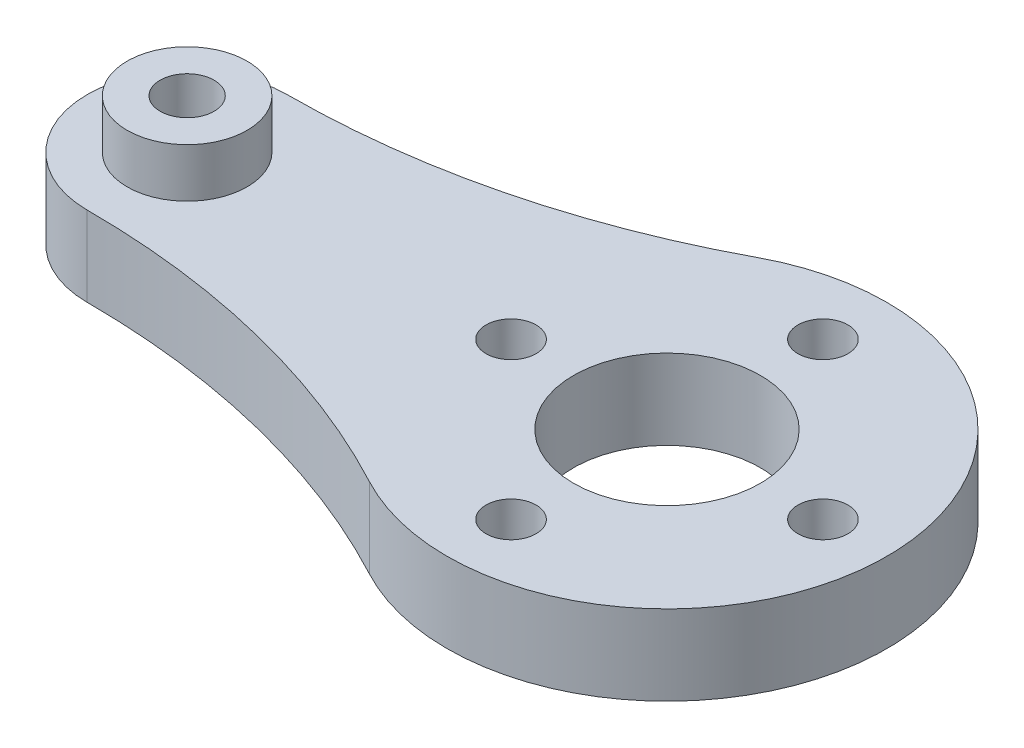
ISO-10303-21;
HEADER;
FILE_DESCRIPTION(('STEP AP214'),'2;1');
FILE_NAME('part.step','',(''),(''),'','','');
FILE_SCHEMA(('AUTOMOTIVE_DESIGN { 1 0 10303 214 1 1 1 1 }'));
ENDSEC;
DATA;
#1=APPLICATION_CONTEXT('core data for automotive mechanical design processes');
#2=APPLICATION_PROTOCOL_DEFINITION('international standard','automotive_design',2000,#1);
#3=PRODUCT_CONTEXT('',#1,'mechanical');
#4=PRODUCT('Part','Part','',(#3));
#5=PRODUCT_RELATED_PRODUCT_CATEGORY('part','',(#4));
#6=PRODUCT_DEFINITION_FORMATION('','',#4);
#7=PRODUCT_DEFINITION_CONTEXT('part definition',#1,'design');
#8=PRODUCT_DEFINITION('design','',#6,#7);
#9=PRODUCT_DEFINITION_SHAPE('','',#8);
#10=(LENGTH_UNIT() NAMED_UNIT(*) SI_UNIT(.MILLI.,.METRE.));
#11=(NAMED_UNIT(*) PLANE_ANGLE_UNIT() SI_UNIT($,.RADIAN.));
#12=(NAMED_UNIT(*) SI_UNIT($,.STERADIAN.) SOLID_ANGLE_UNIT());
#13=UNCERTAINTY_MEASURE_WITH_UNIT(LENGTH_MEASURE(1.E-05),#10,'distance_accuracy_value','');
#14=(GEOMETRIC_REPRESENTATION_CONTEXT(3) GLOBAL_UNCERTAINTY_ASSIGNED_CONTEXT((#13)) GLOBAL_UNIT_ASSIGNED_CONTEXT((#10,
#11,#12)) REPRESENTATION_CONTEXT('',''));
#15=CARTESIAN_POINT('',(0.,0.,0.));
#16=DIRECTION('',(0.,0.,1.));
#17=DIRECTION('',(1.,0.,0.));
#18=AXIS2_PLACEMENT_3D('',#15,#16,#17);
#19=CARTESIAN_POINT('',(-12.,4.,22.5));
#20=DIRECTION('',(0.,1.,0.));
#21=DIRECTION('',(0.,0.,1.));
#22=AXIS2_PLACEMENT_3D('',#19,#20,#21);
#23=PLANE('',#22);
#24=CARTESIAN_POINT('',(11.9999999999999,4.,7.8));
#25=DIRECTION('',(0.,1.,0.));
#26=DIRECTION('',(0.,0.,1.));
#27=AXIS2_PLACEMENT_3D('',#24,#25,#26);
#28=CIRCLE('',#27,1.25);
#29=CARTESIAN_POINT('',(11.9999999999999,4.,9.05));
#30=VERTEX_POINT('',#29);
#31=EDGE_CURVE('E120',#30,#30,#28,.T.);
#32=ORIENTED_EDGE('',*,*,#31,.F.);
#33=EDGE_LOOP('',(#32));
#34=FACE_BOUND('',#33,.T.);
#35=CARTESIAN_POINT('',(12.,4.,-7.8));
#36=DIRECTION('',(0.,1.,0.));
#37=DIRECTION('',(0.,0.,1.));
#38=AXIS2_PLACEMENT_3D('',#35,#36,#37);
#39=CIRCLE('',#38,1.25);
#40=CARTESIAN_POINT('',(12.,4.,-6.55));
#41=VERTEX_POINT('',#40);
#42=EDGE_CURVE('E129',#41,#41,#39,.T.);
#43=ORIENTED_EDGE('',*,*,#42,.F.);
#44=EDGE_LOOP('',(#43));
#45=FACE_BOUND('',#44,.T.);
#46=CARTESIAN_POINT('',(12.,4.,0.));
#47=DIRECTION('',(0.,1.,0.));
#48=DIRECTION('',(0.,0.,1.));
#49=AXIS2_PLACEMENT_3D('',#46,#47,#48);
#50=CIRCLE('',#49,4.675);
#51=CARTESIAN_POINT('',(12.,4.,4.675));
#52=VERTEX_POINT('',#51);
#53=EDGE_CURVE('E141',#52,#52,#50,.T.);
#54=ORIENTED_EDGE('',*,*,#53,.F.);
#55=EDGE_LOOP('',(#54));
#56=FACE_BOUND('',#55,.T.);
#57=CARTESIAN_POINT('',(-12.,4.,45.));
#58=DIRECTION('',(0.,-1.,0.));
#59=DIRECTION('',(0.,0.,1.));
#60=AXIS2_PLACEMENT_3D('',#57,#58,#59);
#61=CIRCLE('',#60,40.);
#62=CARTESIAN_POINT('',(-12.,4.,5.));
#63=VERTEX_POINT('',#62);
#64=CARTESIAN_POINT('',(6.8235294117647,4.,9.70588235294117));
#65=VERTEX_POINT('',#64);
#66=EDGE_CURVE('E87',#63,#65,#61,.T.);
#67=ORIENTED_EDGE('',*,*,#66,.T.);
#68=CARTESIAN_POINT('',(12.,4.,0.));
#69=DIRECTION('',(0.,1.,0.));
#70=DIRECTION('',(0.,0.,1.));
#71=AXIS2_PLACEMENT_3D('',#68,#69,#70);
#72=CIRCLE('',#71,11.);
#73=CARTESIAN_POINT('',(6.82352941176471,4.,-9.70588235294118));
#74=VERTEX_POINT('',#73);
#75=EDGE_CURVE('E82',#65,#74,#72,.T.);
#76=ORIENTED_EDGE('',*,*,#75,.T.);
#77=CARTESIAN_POINT('',(-12.,4.,-45.));
#78=DIRECTION('',(0.,-1.,0.));
#79=DIRECTION('',(0.,0.,-1.));
#80=AXIS2_PLACEMENT_3D('',#77,#78,#79);
#81=CIRCLE('',#80,40.);
#82=CARTESIAN_POINT('',(-12.,4.,-5.));
#83=VERTEX_POINT('',#82);
#84=EDGE_CURVE('E85',#74,#83,#81,.T.);
#85=ORIENTED_EDGE('',*,*,#84,.T.);
#86=CARTESIAN_POINT('',(-12.,4.,0.));
#87=DIRECTION('',(0.,1.,0.));
#88=DIRECTION('',(0.,0.,1.));
#89=AXIS2_PLACEMENT_3D('',#86,#87,#88);
#90=CIRCLE('',#89,5.);
#91=EDGE_CURVE('E52',#83,#63,#90,.T.);
#92=ORIENTED_EDGE('',*,*,#91,.T.);
#93=EDGE_LOOP('',(#67,#76,#85,#92));
#94=FACE_BOUND('',#93,.T.);
#95=CARTESIAN_POINT('',(4.2,4.,0.));
#96=DIRECTION('',(0.,1.,0.));
#97=DIRECTION('',(0.,0.,1.));
#98=AXIS2_PLACEMENT_3D('',#95,#96,#97);
#99=CIRCLE('',#98,1.25);
#100=CARTESIAN_POINT('',(4.2,4.,1.25));
#101=VERTEX_POINT('',#100);
#102=EDGE_CURVE('E103',#101,#101,#99,.T.);
#103=ORIENTED_EDGE('',*,*,#102,.F.);
#104=EDGE_LOOP('',(#103));
#105=FACE_BOUND('',#104,.T.);
#106=CARTESIAN_POINT('',(19.8,4.,0.));
#107=DIRECTION('',(0.,1.,0.));
#108=DIRECTION('',(0.,0.,1.));
#109=AXIS2_PLACEMENT_3D('',#106,#107,#108);
#110=CIRCLE('',#109,1.25);
#111=CARTESIAN_POINT('',(19.8,4.,1.25));
#112=VERTEX_POINT('',#111);
#113=EDGE_CURVE('E124',#112,#112,#110,.T.);
#114=ORIENTED_EDGE('',*,*,#113,.F.);
#115=EDGE_LOOP('',(#114));
#116=FACE_BOUND('',#115,.T.);
#117=CARTESIAN_POINT('',(-12.,4.,0.));
#118=DIRECTION('',(0.,1.,0.));
#119=DIRECTION('',(0.,0.,1.));
#120=AXIS2_PLACEMENT_3D('',#117,#118,#119);
#121=CIRCLE('',#120,3.);
#122=CARTESIAN_POINT('',(-12.,4.,3.));
#123=VERTEX_POINT('',#122);
#124=EDGE_CURVE('E158',#123,#123,#121,.T.);
#125=ORIENTED_EDGE('',*,*,#124,.F.);
#126=EDGE_LOOP('',(#125));
#127=FACE_BOUND('',#126,.T.);
#128=ADVANCED_FACE('F33',(#34,#45,#56,#94,#105,#116,#127),#23,.T.);
#129=CARTESIAN_POINT('',(4.2,4.,0.));
#130=DIRECTION('',(0.,-1.,0.));
#131=DIRECTION('',(0.,0.,-1.));
#132=AXIS2_PLACEMENT_3D('',#129,#130,#131);
#133=CYLINDRICAL_SURFACE('',#132,1.25);
#134=ORIENTED_EDGE('',*,*,#102,.T.);
#135=EDGE_LOOP('',(#134));
#136=FACE_BOUND('',#135,.T.);
#137=CARTESIAN_POINT('',(4.2,1.,0.));
#138=DIRECTION('',(0.,-1.,0.));
#139=DIRECTION('',(0.,0.,-1.));
#140=AXIS2_PLACEMENT_3D('',#137,#138,#139);
#141=CIRCLE('',#140,1.25);
#142=CARTESIAN_POINT('',(4.2,1.,-1.25));
#143=VERTEX_POINT('',#142);
#144=EDGE_CURVE('E37',#143,#143,#141,.T.);
#145=ORIENTED_EDGE('',*,*,#144,.T.);
#146=EDGE_LOOP('',(#145));
#147=FACE_BOUND('',#146,.T.);
#148=ADVANCED_FACE('F149',(#136,#147),#133,.F.);
#149=CARTESIAN_POINT('',(12.,4.,-7.8));
#150=DIRECTION('',(0.,-1.,0.));
#151=DIRECTION('',(0.,0.,-1.));
#152=AXIS2_PLACEMENT_3D('',#149,#150,#151);
#153=CYLINDRICAL_SURFACE('',#152,1.25);
#154=ORIENTED_EDGE('',*,*,#42,.T.);
#155=EDGE_LOOP('',(#154));
#156=FACE_BOUND('',#155,.T.);
#157=CARTESIAN_POINT('',(12.,1.,-7.8));
#158=DIRECTION('',(0.,-1.,0.));
#159=DIRECTION('',(0.,0.,-1.));
#160=AXIS2_PLACEMENT_3D('',#157,#158,#159);
#161=CIRCLE('',#160,1.25);
#162=CARTESIAN_POINT('',(12.,1.,-9.05));
#163=VERTEX_POINT('',#162);
#164=EDGE_CURVE('E115',#163,#163,#161,.T.);
#165=ORIENTED_EDGE('',*,*,#164,.T.);
#166=EDGE_LOOP('',(#165));
#167=FACE_BOUND('',#166,.T.);
#168=ADVANCED_FACE('F259',(#156,#167),#153,.F.);
#169=CARTESIAN_POINT('',(19.8,4.,0.));
#170=DIRECTION('',(0.,-1.,0.));
#171=DIRECTION('',(0.,0.,-1.));
#172=AXIS2_PLACEMENT_3D('',#169,#170,#171);
#173=CYLINDRICAL_SURFACE('',#172,1.25);
#174=ORIENTED_EDGE('',*,*,#113,.T.);
#175=EDGE_LOOP('',(#174));
#176=FACE_BOUND('',#175,.T.);
#177=CARTESIAN_POINT('',(19.8,1.,0.));
#178=DIRECTION('',(0.,-1.,0.));
#179=DIRECTION('',(0.,0.,-1.));
#180=AXIS2_PLACEMENT_3D('',#177,#178,#179);
#181=CIRCLE('',#180,1.25);
#182=CARTESIAN_POINT('',(19.8,1.,-1.25));
#183=VERTEX_POINT('',#182);
#184=EDGE_CURVE('E112',#183,#183,#181,.T.);
#185=ORIENTED_EDGE('',*,*,#184,.T.);
#186=EDGE_LOOP('',(#185));
#187=FACE_BOUND('',#186,.T.);
#188=ADVANCED_FACE('F256',(#176,#187),#173,.F.);
#189=CARTESIAN_POINT('',(11.9999999999999,4.,7.8));
#190=DIRECTION('',(0.,-1.,0.));
#191=DIRECTION('',(0.,0.,-1.));
#192=AXIS2_PLACEMENT_3D('',#189,#190,#191);
#193=CYLINDRICAL_SURFACE('',#192,1.25);
#194=ORIENTED_EDGE('',*,*,#31,.T.);
#195=EDGE_LOOP('',(#194));
#196=FACE_BOUND('',#195,.T.);
#197=CARTESIAN_POINT('',(11.9999999999999,1.,7.8));
#198=DIRECTION('',(0.,-1.,0.));
#199=DIRECTION('',(0.,0.,-1.));
#200=AXIS2_PLACEMENT_3D('',#197,#198,#199);
#201=CIRCLE('',#200,1.25);
#202=CARTESIAN_POINT('',(11.9999999999999,1.,6.55));
#203=VERTEX_POINT('',#202);
#204=EDGE_CURVE('E109',#203,#203,#201,.T.);
#205=ORIENTED_EDGE('',*,*,#204,.T.);
#206=EDGE_LOOP('',(#205));
#207=FACE_BOUND('',#206,.T.);
#208=ADVANCED_FACE('F196',(#196,#207),#193,.F.);
#209=CARTESIAN_POINT('',(-12.,0.,22.5));
#210=DIRECTION('',(0.,1.,0.));
#211=DIRECTION('',(0.,0.,1.));
#212=AXIS2_PLACEMENT_3D('',#209,#210,#211);
#213=PLANE('',#212);
#214=CARTESIAN_POINT('',(12.,0.,-7.8));
#215=DIRECTION('',(0.,-1.,0.));
#216=DIRECTION('',(0.,0.,-1.));
#217=AXIS2_PLACEMENT_3D('',#214,#215,#216);
#218=CIRCLE('',#217,2.75);
#219=CARTESIAN_POINT('',(12.,0.,-10.55));
#220=VERTEX_POINT('',#219);
#221=EDGE_CURVE('E170',#220,#220,#218,.T.);
#222=ORIENTED_EDGE('',*,*,#221,.F.);
#223=EDGE_LOOP('',(#222));
#224=FACE_BOUND('',#223,.T.);
#225=CARTESIAN_POINT('',(4.2,0.,0.));
#226=DIRECTION('',(0.,-1.,0.));
#227=DIRECTION('',(0.,0.,-1.));
#228=AXIS2_PLACEMENT_3D('',#225,#226,#227);
#229=CIRCLE('',#228,2.75);
#230=CARTESIAN_POINT('',(4.2,0.,-2.75));
#231=VERTEX_POINT('',#230);
#232=EDGE_CURVE('E176',#231,#231,#229,.T.);
#233=ORIENTED_EDGE('',*,*,#232,.F.);
#234=EDGE_LOOP('',(#233));
#235=FACE_BOUND('',#234,.T.);
#236=CARTESIAN_POINT('',(12.,0.,7.8));
#237=DIRECTION('',(0.,-1.,0.));
#238=DIRECTION('',(0.,0.,-1.));
#239=AXIS2_PLACEMENT_3D('',#236,#237,#238);
#240=CIRCLE('',#239,2.75);
#241=CARTESIAN_POINT('',(12.,0.,5.05));
#242=VERTEX_POINT('',#241);
#243=EDGE_CURVE('E182',#242,#242,#240,.T.);
#244=ORIENTED_EDGE('',*,*,#243,.F.);
#245=EDGE_LOOP('',(#244));
#246=FACE_BOUND('',#245,.T.);
#247=CARTESIAN_POINT('',(19.8,0.,0.));
#248=DIRECTION('',(0.,-1.,0.));
#249=DIRECTION('',(0.,0.,-1.));
#250=AXIS2_PLACEMENT_3D('',#247,#248,#249);
#251=CIRCLE('',#250,2.75);
#252=CARTESIAN_POINT('',(19.8,0.,-2.75000000000005));
#253=VERTEX_POINT('',#252);
#254=EDGE_CURVE('E132',#253,#253,#251,.T.);
#255=ORIENTED_EDGE('',*,*,#254,.F.);
#256=EDGE_LOOP('',(#255));
#257=FACE_BOUND('',#256,.T.);
#258=CARTESIAN_POINT('',(-12.,0.,45.));
#259=DIRECTION('',(0.,-1.,0.));
#260=DIRECTION('',(0.,0.,1.));
#261=AXIS2_PLACEMENT_3D('',#258,#259,#260);
#262=CIRCLE('',#261,40.);
#263=CARTESIAN_POINT('',(-12.,0.,5.));
#264=VERTEX_POINT('',#263);
#265=CARTESIAN_POINT('',(6.8235294117647,0.,9.70588235294117));
#266=VERTEX_POINT('',#265);
#267=EDGE_CURVE('E100',#264,#266,#262,.T.);
#268=ORIENTED_EDGE('',*,*,#267,.F.);
#269=CARTESIAN_POINT('',(-12.,0.,0.));
#270=DIRECTION('',(0.,1.,0.));
#271=DIRECTION('',(0.,0.,1.));
#272=AXIS2_PLACEMENT_3D('',#269,#270,#271);
#273=CIRCLE('',#272,5.);
#274=CARTESIAN_POINT('',(-12.,0.,-5.));
#275=VERTEX_POINT('',#274);
#276=EDGE_CURVE('E75',#275,#264,#273,.T.);
#277=ORIENTED_EDGE('',*,*,#276,.F.);
#278=CARTESIAN_POINT('',(-12.,0.,-45.));
#279=DIRECTION('',(0.,-1.,0.));
#280=DIRECTION('',(0.,0.,-1.));
#281=AXIS2_PLACEMENT_3D('',#278,#279,#280);
#282=CIRCLE('',#281,40.);
#283=CARTESIAN_POINT('',(6.82352941176471,0.,-9.70588235294118));
#284=VERTEX_POINT('',#283);
#285=EDGE_CURVE('E69',#284,#275,#282,.T.);
#286=ORIENTED_EDGE('',*,*,#285,.F.);
#287=CARTESIAN_POINT('',(12.,0.,0.));
#288=DIRECTION('',(0.,1.,0.));
#289=DIRECTION('',(0.,0.,1.));
#290=AXIS2_PLACEMENT_3D('',#287,#288,#289);
#291=CIRCLE('',#290,11.);
#292=EDGE_CURVE('E91',#266,#284,#291,.T.);
#293=ORIENTED_EDGE('',*,*,#292,.F.);
#294=EDGE_LOOP('',(#268,#277,#286,#293));
#295=FACE_BOUND('',#294,.T.);
#296=CARTESIAN_POINT('',(12.,0.,0.));
#297=DIRECTION('',(0.,1.,0.));
#298=DIRECTION('',(0.,0.,1.));
#299=AXIS2_PLACEMENT_3D('',#296,#297,#298);
#300=CIRCLE('',#299,4.675);
#301=CARTESIAN_POINT('',(12.,0.,4.675));
#302=VERTEX_POINT('',#301);
#303=EDGE_CURVE('E140',#302,#302,#300,.T.);
#304=ORIENTED_EDGE('',*,*,#303,.T.);
#305=EDGE_LOOP('',(#304));
#306=FACE_BOUND('',#305,.T.);
#307=CARTESIAN_POINT('',(-12.,0.,0.));
#308=DIRECTION('',(0.,1.,0.));
#309=DIRECTION('',(0.,0.,1.));
#310=AXIS2_PLACEMENT_3D('',#307,#308,#309);
#311=CIRCLE('',#310,1.35);
#312=CARTESIAN_POINT('',(-12.,0.,1.35));
#313=VERTEX_POINT('',#312);
#314=EDGE_CURVE('E137',#313,#313,#311,.T.);
#315=ORIENTED_EDGE('',*,*,#314,.T.);
#316=EDGE_LOOP('',(#315));
#317=FACE_BOUND('',#316,.T.);
#318=ADVANCED_FACE('F193',(#224,#235,#246,#257,#295,#306,#317),#213,.F.);
#319=CARTESIAN_POINT('',(-12.,4.,45.));
#320=DIRECTION('',(0.,-1.,0.));
#321=DIRECTION('',(0.,0.,-1.));
#322=AXIS2_PLACEMENT_3D('',#319,#320,#321);
#323=CYLINDRICAL_SURFACE('',#322,40.);
#324=ORIENTED_EDGE('',*,*,#267,.T.);
#325=DIRECTION('',(0.,-1.,0.));
#326=VECTOR('',#325,1.);
#327=CARTESIAN_POINT('',(6.8235294117647,4.,9.70588235294117));
#328=LINE('',#327,#326);
#329=EDGE_CURVE('E11',#65,#266,#328,.T.);
#330=ORIENTED_EDGE('',*,*,#329,.F.);
#331=ORIENTED_EDGE('',*,*,#66,.F.);
#332=DIRECTION('',(0.,-1.,0.));
#333=VECTOR('',#332,1.);
#334=CARTESIAN_POINT('',(-12.,4.,5.));
#335=LINE('',#334,#333);
#336=EDGE_CURVE('E96',#63,#264,#335,.T.);
#337=ORIENTED_EDGE('',*,*,#336,.T.);
#338=EDGE_LOOP('',(#324,#330,#331,#337));
#339=FACE_BOUND('',#338,.T.);
#340=ADVANCED_FACE('F35',(#339),#323,.F.);
#341=CARTESIAN_POINT('',(12.,4.,0.));
#342=DIRECTION('',(0.,-1.,0.));
#343=DIRECTION('',(0.,0.,-1.));
#344=AXIS2_PLACEMENT_3D('',#341,#342,#343);
#345=CYLINDRICAL_SURFACE('',#344,11.);
#346=ORIENTED_EDGE('',*,*,#292,.T.);
#347=DIRECTION('',(0.,-1.,0.));
#348=VECTOR('',#347,1.);
#349=CARTESIAN_POINT('',(6.82352941176471,4.,-9.70588235294118));
#350=LINE('',#349,#348);
#351=EDGE_CURVE('E43',#74,#284,#350,.T.);
#352=ORIENTED_EDGE('',*,*,#351,.F.);
#353=ORIENTED_EDGE('',*,*,#75,.F.);
#354=ORIENTED_EDGE('',*,*,#329,.T.);
#355=EDGE_LOOP('',(#346,#352,#353,#354));
#356=FACE_BOUND('',#355,.T.);
#357=ADVANCED_FACE('F90',(#356),#345,.T.);
#358=CARTESIAN_POINT('',(-12.,4.,-45.));
#359=DIRECTION('',(0.,-1.,0.));
#360=DIRECTION('',(0.,0.,-1.));
#361=AXIS2_PLACEMENT_3D('',#358,#359,#360);
#362=CYLINDRICAL_SURFACE('',#361,40.);
#363=ORIENTED_EDGE('',*,*,#285,.T.);
#364=DIRECTION('',(0.,-1.,0.));
#365=VECTOR('',#364,1.);
#366=CARTESIAN_POINT('',(-12.,4.,-5.));
#367=LINE('',#366,#365);
#368=EDGE_CURVE('E92',#83,#275,#367,.T.);
#369=ORIENTED_EDGE('',*,*,#368,.F.);
#370=ORIENTED_EDGE('',*,*,#84,.F.);
#371=ORIENTED_EDGE('',*,*,#351,.T.);
#372=EDGE_LOOP('',(#363,#369,#370,#371));
#373=FACE_BOUND('',#372,.T.);
#374=ADVANCED_FACE('F94',(#373),#362,.F.);
#375=CARTESIAN_POINT('',(-12.,4.,0.));
#376=DIRECTION('',(0.,-1.,0.));
#377=DIRECTION('',(0.,0.,-1.));
#378=AXIS2_PLACEMENT_3D('',#375,#376,#377);
#379=CYLINDRICAL_SURFACE('',#378,5.);
#380=ORIENTED_EDGE('',*,*,#276,.T.);
#381=ORIENTED_EDGE('',*,*,#336,.F.);
#382=ORIENTED_EDGE('',*,*,#91,.F.);
#383=ORIENTED_EDGE('',*,*,#368,.T.);
#384=EDGE_LOOP('',(#380,#381,#382,#383));
#385=FACE_BOUND('',#384,.T.);
#386=ADVANCED_FACE('F266',(#385),#379,.T.);
#387=CARTESIAN_POINT('',(12.,4.,0.));
#388=DIRECTION('',(0.,-1.,0.));
#389=DIRECTION('',(0.,0.,-1.));
#390=AXIS2_PLACEMENT_3D('',#387,#388,#389);
#391=CYLINDRICAL_SURFACE('',#390,4.675);
#392=ORIENTED_EDGE('',*,*,#53,.T.);
#393=EDGE_LOOP('',(#392));
#394=FACE_BOUND('',#393,.T.);
#395=ORIENTED_EDGE('',*,*,#303,.F.);
#396=EDGE_LOOP('',(#395));
#397=FACE_BOUND('',#396,.T.);
#398=ADVANCED_FACE('F209',(#394,#397),#391,.F.);
#399=CARTESIAN_POINT('',(-12.,4.,0.));
#400=DIRECTION('',(0.,-1.,0.));
#401=DIRECTION('',(0.,0.,-1.));
#402=AXIS2_PLACEMENT_3D('',#399,#400,#401);
#403=CYLINDRICAL_SURFACE('',#402,1.35);
#404=ORIENTED_EDGE('',*,*,#314,.F.);
#405=EDGE_LOOP('',(#404));
#406=FACE_BOUND('',#405,.T.);
#407=CARTESIAN_POINT('',(-12.,6.45,0.));
#408=DIRECTION('',(0.,1.,0.));
#409=DIRECTION('',(0.,0.,1.));
#410=AXIS2_PLACEMENT_3D('',#407,#408,#409);
#411=CIRCLE('',#410,1.35);
#412=CARTESIAN_POINT('',(-12.,6.45,1.35));
#413=VERTEX_POINT('',#412);
#414=EDGE_CURVE('E161',#413,#413,#411,.T.);
#415=ORIENTED_EDGE('',*,*,#414,.T.);
#416=EDGE_LOOP('',(#415));
#417=FACE_BOUND('',#416,.T.);
#418=ADVANCED_FACE('F205',(#406,#417),#403,.F.);
#419=CARTESIAN_POINT('',(12.,1.,7.8));
#420=DIRECTION('',(0.,-1.,0.));
#421=DIRECTION('',(0.,0.,-1.));
#422=AXIS2_PLACEMENT_3D('',#419,#420,#421);
#423=CYLINDRICAL_SURFACE('',#422,2.75);
#424=CARTESIAN_POINT('',(12.,1.,7.8));
#425=DIRECTION('',(0.,-1.,0.));
#426=DIRECTION('',(0.,0.,-1.));
#427=AXIS2_PLACEMENT_3D('',#424,#425,#426);
#428=CIRCLE('',#427,2.75);
#429=CARTESIAN_POINT('',(12.,1.,5.05));
#430=VERTEX_POINT('',#429);
#431=EDGE_CURVE('E179',#430,#430,#428,.T.);
#432=ORIENTED_EDGE('',*,*,#431,.F.);
#433=EDGE_LOOP('',(#432));
#434=FACE_BOUND('',#433,.T.);
#435=ORIENTED_EDGE('',*,*,#243,.T.);
#436=EDGE_LOOP('',(#435));
#437=FACE_BOUND('',#436,.T.);
#438=ADVANCED_FACE('F208',(#434,#437),#423,.F.);
#439=CARTESIAN_POINT('',(12.,1.,7.8));
#440=DIRECTION('',(0.,-1.,0.));
#441=DIRECTION('',(0.,0.,-1.));
#442=AXIS2_PLACEMENT_3D('',#439,#440,#441);
#443=PLANE('',#442);
#444=ORIENTED_EDGE('',*,*,#204,.F.);
#445=EDGE_LOOP('',(#444));
#446=FACE_BOUND('',#445,.T.);
#447=ORIENTED_EDGE('',*,*,#431,.T.);
#448=EDGE_LOOP('',(#447));
#449=FACE_BOUND('',#448,.T.);
#450=ADVANCED_FACE('F241',(#446,#449),#443,.T.);
#451=CARTESIAN_POINT('',(19.8,1.,0.));
#452=DIRECTION('',(0.,-1.,0.));
#453=DIRECTION('',(0.,0.,-1.));
#454=AXIS2_PLACEMENT_3D('',#451,#452,#453);
#455=CYLINDRICAL_SURFACE('',#454,2.75);
#456=CARTESIAN_POINT('',(19.8,1.,0.));
#457=DIRECTION('',(0.,-1.,0.));
#458=DIRECTION('',(0.,0.,-1.));
#459=AXIS2_PLACEMENT_3D('',#456,#457,#458);
#460=CIRCLE('',#459,2.75);
#461=CARTESIAN_POINT('',(19.8,1.,-2.75000000000005));
#462=VERTEX_POINT('',#461);
#463=EDGE_CURVE('E184',#462,#462,#460,.T.);
#464=ORIENTED_EDGE('',*,*,#463,.F.);
#465=EDGE_LOOP('',(#464));
#466=FACE_BOUND('',#465,.T.);
#467=ORIENTED_EDGE('',*,*,#254,.T.);
#468=EDGE_LOOP('',(#467));
#469=FACE_BOUND('',#468,.T.);
#470=ADVANCED_FACE('F191',(#466,#469),#455,.F.);
#471=CARTESIAN_POINT('',(19.8,1.,0.));
#472=DIRECTION('',(0.,-1.,0.));
#473=DIRECTION('',(0.,0.,-1.));
#474=AXIS2_PLACEMENT_3D('',#471,#472,#473);
#475=PLANE('',#474);
#476=ORIENTED_EDGE('',*,*,#184,.F.);
#477=EDGE_LOOP('',(#476));
#478=FACE_BOUND('',#477,.T.);
#479=ORIENTED_EDGE('',*,*,#463,.T.);
#480=EDGE_LOOP('',(#479));
#481=FACE_BOUND('',#480,.T.);
#482=ADVANCED_FACE('F235',(#478,#481),#475,.T.);
#483=CARTESIAN_POINT('',(12.,1.,-7.8));
#484=DIRECTION('',(0.,-1.,0.));
#485=DIRECTION('',(0.,0.,-1.));
#486=AXIS2_PLACEMENT_3D('',#483,#484,#485);
#487=CYLINDRICAL_SURFACE('',#486,2.75);
#488=CARTESIAN_POINT('',(12.,1.,-7.8));
#489=DIRECTION('',(0.,-1.,0.));
#490=DIRECTION('',(0.,0.,-1.));
#491=AXIS2_PLACEMENT_3D('',#488,#489,#490);
#492=CIRCLE('',#491,2.75);
#493=CARTESIAN_POINT('',(12.,1.,-10.55));
#494=VERTEX_POINT('',#493);
#495=EDGE_CURVE('E113',#494,#494,#492,.T.);
#496=ORIENTED_EDGE('',*,*,#495,.F.);
#497=EDGE_LOOP('',(#496));
#498=FACE_BOUND('',#497,.T.);
#499=ORIENTED_EDGE('',*,*,#221,.T.);
#500=EDGE_LOOP('',(#499));
#501=FACE_BOUND('',#500,.T.);
#502=ADVANCED_FACE('F232',(#498,#501),#487,.F.);
#503=CARTESIAN_POINT('',(12.,1.,-7.8));
#504=DIRECTION('',(0.,-1.,0.));
#505=DIRECTION('',(0.,0.,-1.));
#506=AXIS2_PLACEMENT_3D('',#503,#504,#505);
#507=PLANE('',#506);
#508=ORIENTED_EDGE('',*,*,#164,.F.);
#509=EDGE_LOOP('',(#508));
#510=FACE_BOUND('',#509,.T.);
#511=ORIENTED_EDGE('',*,*,#495,.T.);
#512=EDGE_LOOP('',(#511));
#513=FACE_BOUND('',#512,.T.);
#514=ADVANCED_FACE('F229',(#510,#513),#507,.T.);
#515=CARTESIAN_POINT('',(4.2,1.,0.));
#516=DIRECTION('',(0.,-1.,0.));
#517=DIRECTION('',(0.,0.,-1.));
#518=AXIS2_PLACEMENT_3D('',#515,#516,#517);
#519=CYLINDRICAL_SURFACE('',#518,2.75);
#520=CARTESIAN_POINT('',(4.2,1.,0.));
#521=DIRECTION('',(0.,-1.,0.));
#522=DIRECTION('',(0.,0.,-1.));
#523=AXIS2_PLACEMENT_3D('',#520,#521,#522);
#524=CIRCLE('',#523,2.75);
#525=CARTESIAN_POINT('',(4.2,1.,-2.75));
#526=VERTEX_POINT('',#525);
#527=EDGE_CURVE('E173',#526,#526,#524,.T.);
#528=ORIENTED_EDGE('',*,*,#527,.F.);
#529=EDGE_LOOP('',(#528));
#530=FACE_BOUND('',#529,.T.);
#531=ORIENTED_EDGE('',*,*,#232,.T.);
#532=EDGE_LOOP('',(#531));
#533=FACE_BOUND('',#532,.T.);
#534=ADVANCED_FACE('F225',(#530,#533),#519,.F.);
#535=CARTESIAN_POINT('',(4.2,1.,0.));
#536=DIRECTION('',(0.,-1.,0.));
#537=DIRECTION('',(0.,0.,-1.));
#538=AXIS2_PLACEMENT_3D('',#535,#536,#537);
#539=PLANE('',#538);
#540=ORIENTED_EDGE('',*,*,#144,.F.);
#541=EDGE_LOOP('',(#540));
#542=FACE_BOUND('',#541,.T.);
#543=ORIENTED_EDGE('',*,*,#527,.T.);
#544=EDGE_LOOP('',(#543));
#545=FACE_BOUND('',#544,.T.);
#546=ADVANCED_FACE('F216',(#542,#545),#539,.T.);
#547=CARTESIAN_POINT('',(-12.,6.45,0.));
#548=DIRECTION('',(0.,1.,0.));
#549=DIRECTION('',(0.,0.,1.));
#550=AXIS2_PLACEMENT_3D('',#547,#548,#549);
#551=PLANE('',#550);
#552=CARTESIAN_POINT('',(-12.,6.45,0.));
#553=DIRECTION('',(0.,1.,0.));
#554=DIRECTION('',(0.,0.,1.));
#555=AXIS2_PLACEMENT_3D('',#552,#553,#554);
#556=CIRCLE('',#555,3.);
#557=CARTESIAN_POINT('',(-12.,6.45,3.));
#558=VERTEX_POINT('',#557);
#559=EDGE_CURVE('E160',#558,#558,#556,.T.);
#560=ORIENTED_EDGE('',*,*,#559,.T.);
#561=EDGE_LOOP('',(#560));
#562=FACE_BOUND('',#561,.T.);
#563=ORIENTED_EDGE('',*,*,#414,.F.);
#564=EDGE_LOOP('',(#563));
#565=FACE_BOUND('',#564,.T.);
#566=ADVANCED_FACE('F213',(#562,#565),#551,.T.);
#567=CARTESIAN_POINT('',(-12.,6.45,0.));
#568=DIRECTION('',(0.,-1.,0.));
#569=DIRECTION('',(0.,0.,-1.));
#570=AXIS2_PLACEMENT_3D('',#567,#568,#569);
#571=CYLINDRICAL_SURFACE('',#570,3.);
#572=ORIENTED_EDGE('',*,*,#559,.F.);
#573=EDGE_LOOP('',(#572));
#574=FACE_BOUND('',#573,.T.);
#575=ORIENTED_EDGE('',*,*,#124,.T.);
#576=EDGE_LOOP('',(#575));
#577=FACE_BOUND('',#576,.T.);
#578=ADVANCED_FACE('F215',(#574,#577),#571,.T.);
#579=CLOSED_SHELL('',(#128,#148,#168,#188,#208,#318,#340,#357,#374,#386,#398,#418,#438,#450,
#470,#482,#502,#514,#534,#546,#566,#578));
#580=MANIFOLD_SOLID_BREP('B2',#579);
#581=ADVANCED_BREP_SHAPE_REPRESENTATION('',(#18,#580),#14);
#582=SHAPE_DEFINITION_REPRESENTATION(#9,#581);
ENDSEC;
END-ISO-10303-21;
